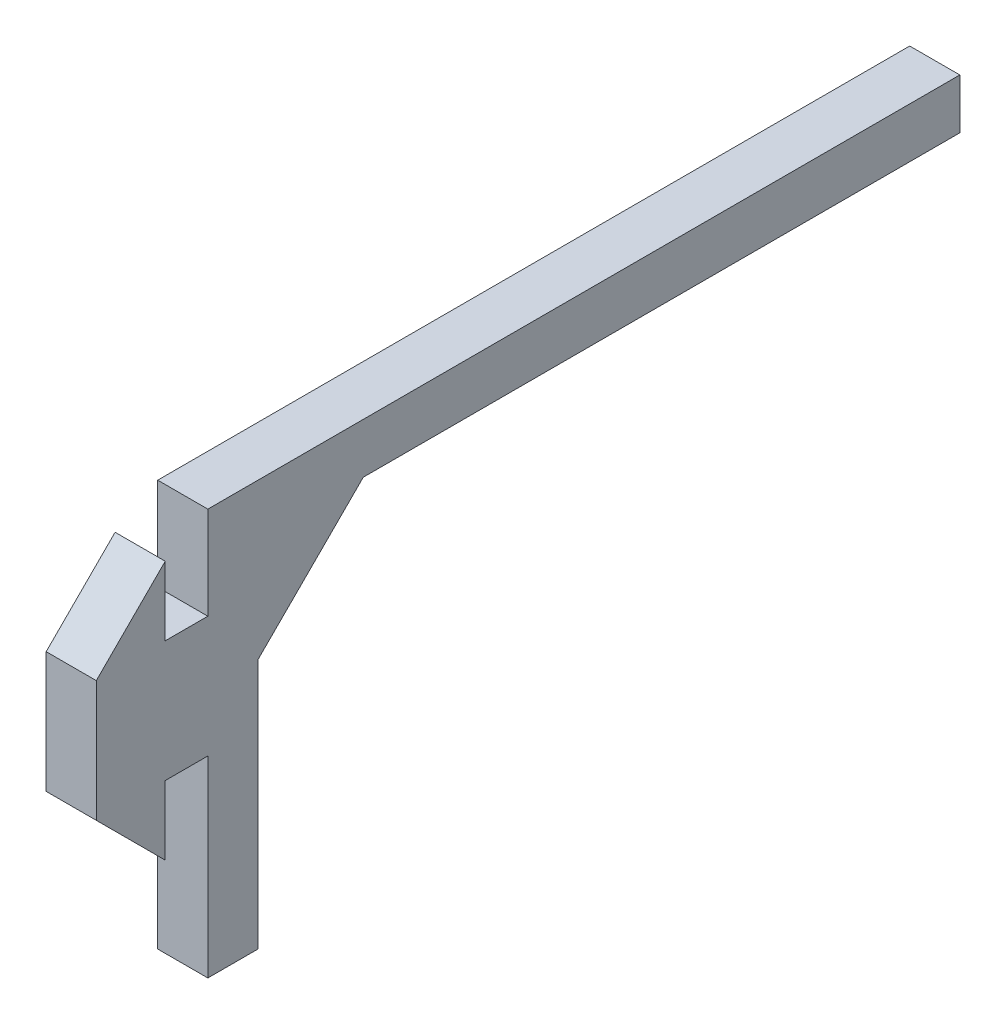
ISO-10303-21;
HEADER;
FILE_DESCRIPTION(('STEP AP214'),'2;1');
FILE_NAME('part.step','',(''),(''),'','','');
FILE_SCHEMA(('AUTOMOTIVE_DESIGN { 1 0 10303 214 1 1 1 1 }'));
ENDSEC;
DATA;
#1=APPLICATION_CONTEXT('core data for automotive mechanical design processes');
#2=APPLICATION_PROTOCOL_DEFINITION('international standard','automotive_design',2000,#1);
#3=PRODUCT_CONTEXT('',#1,'mechanical');
#4=PRODUCT('Part','Part','',(#3));
#5=PRODUCT_RELATED_PRODUCT_CATEGORY('part','',(#4));
#6=PRODUCT_DEFINITION_FORMATION('','',#4);
#7=PRODUCT_DEFINITION_CONTEXT('part definition',#1,'design');
#8=PRODUCT_DEFINITION('design','',#6,#7);
#9=PRODUCT_DEFINITION_SHAPE('','',#8);
#10=(LENGTH_UNIT() NAMED_UNIT(*) SI_UNIT(.MILLI.,.METRE.));
#11=(NAMED_UNIT(*) PLANE_ANGLE_UNIT() SI_UNIT($,.RADIAN.));
#12=(NAMED_UNIT(*) SI_UNIT($,.STERADIAN.) SOLID_ANGLE_UNIT());
#13=UNCERTAINTY_MEASURE_WITH_UNIT(LENGTH_MEASURE(1.E-05),#10,'distance_accuracy_value','');
#14=(GEOMETRIC_REPRESENTATION_CONTEXT(3) GLOBAL_UNCERTAINTY_ASSIGNED_CONTEXT((#13)) GLOBAL_UNIT_ASSIGNED_CONTEXT((#10,
#11,#12)) REPRESENTATION_CONTEXT('',''));
#15=CARTESIAN_POINT('',(0.,0.,0.));
#16=DIRECTION('',(0.,0.,1.));
#17=DIRECTION('',(1.,0.,0.));
#18=AXIS2_PLACEMENT_3D('',#15,#16,#17);
#19=CARTESIAN_POINT('',(2.,14.2,0.));
#20=DIRECTION('',(0.,-1.,0.));
#21=DIRECTION('',(0.,0.,-1.));
#22=AXIS2_PLACEMENT_3D('',#19,#20,#21);
#23=PLANE('',#22);
#24=DIRECTION('',(0.,0.,1.));
#25=VECTOR('',#24,1.);
#26=CARTESIAN_POINT('',(0.,14.2,0.));
#27=LINE('',#26,#25);
#28=CARTESIAN_POINT('',(0.,14.2,-30.));
#29=VERTEX_POINT('',#28);
#30=CARTESIAN_POINT('',(0.,14.2,-6.19999999999999));
#31=VERTEX_POINT('',#30);
#32=EDGE_CURVE('E172',#29,#31,#27,.T.);
#33=ORIENTED_EDGE('',*,*,#32,.F.);
#34=DIRECTION('',(-1.,0.,0.));
#35=VECTOR('',#34,1.);
#36=CARTESIAN_POINT('',(2.,14.2,-30.));
#37=LINE('',#36,#35);
#38=CARTESIAN_POINT('',(2.,14.2,-30.));
#39=VERTEX_POINT('',#38);
#40=EDGE_CURVE('E11',#39,#29,#37,.T.);
#41=ORIENTED_EDGE('',*,*,#40,.F.);
#42=DIRECTION('',(0.,0.,1.));
#43=VECTOR('',#42,1.);
#44=CARTESIAN_POINT('',(2.,14.2,0.));
#45=LINE('',#44,#43);
#46=CARTESIAN_POINT('',(2.,14.2,-6.19999999999999));
#47=VERTEX_POINT('',#46);
#48=EDGE_CURVE('E208',#39,#47,#45,.T.);
#49=ORIENTED_EDGE('',*,*,#48,.T.);
#50=DIRECTION('',(-1.,0.,0.));
#51=VECTOR('',#50,1.);
#52=CARTESIAN_POINT('',(2.,14.2,-6.19999999999999));
#53=LINE('',#52,#51);
#54=EDGE_CURVE('E106',#47,#31,#53,.T.);
#55=ORIENTED_EDGE('',*,*,#54,.T.);
#56=EDGE_LOOP('',(#33,#41,#49,#55));
#57=FACE_BOUND('',#56,.T.);
#58=ADVANCED_FACE('F35',(#57),#23,.T.);
#59=CARTESIAN_POINT('',(2.,0.,-30.));
#60=DIRECTION('',(0.,0.,-1.));
#61=DIRECTION('',(-1.,0.,0.));
#62=AXIS2_PLACEMENT_3D('',#59,#60,#61);
#63=PLANE('',#62);
#64=DIRECTION('',(0.,-1.,0.));
#65=VECTOR('',#64,1.);
#66=CARTESIAN_POINT('',(0.,0.,-30.));
#67=LINE('',#66,#65);
#68=CARTESIAN_POINT('',(0.,16.2,-30.));
#69=VERTEX_POINT('',#68);
#70=EDGE_CURVE('E175',#69,#29,#67,.T.);
#71=ORIENTED_EDGE('',*,*,#70,.F.);
#72=DIRECTION('',(-1.,0.,0.));
#73=VECTOR('',#72,1.);
#74=CARTESIAN_POINT('',(2.,16.2,-30.));
#75=LINE('',#74,#73);
#76=CARTESIAN_POINT('',(2.,16.2,-30.));
#77=VERTEX_POINT('',#76);
#78=EDGE_CURVE('E43',#77,#69,#75,.T.);
#79=ORIENTED_EDGE('',*,*,#78,.F.);
#80=DIRECTION('',(0.,-1.,0.));
#81=VECTOR('',#80,1.);
#82=CARTESIAN_POINT('',(2.,0.,-30.));
#83=LINE('',#82,#81);
#84=EDGE_CURVE('E253',#77,#39,#83,.T.);
#85=ORIENTED_EDGE('',*,*,#84,.T.);
#86=ORIENTED_EDGE('',*,*,#40,.T.);
#87=EDGE_LOOP('',(#71,#79,#85,#86));
#88=FACE_BOUND('',#87,.T.);
#89=ADVANCED_FACE('F241',(#88),#63,.T.);
#90=CARTESIAN_POINT('',(2.,16.2,0.));
#91=DIRECTION('',(0.,1.,0.));
#92=DIRECTION('',(0.,0.,1.));
#93=AXIS2_PLACEMENT_3D('',#90,#91,#92);
#94=PLANE('',#93);
#95=DIRECTION('',(0.,0.,-1.));
#96=VECTOR('',#95,1.);
#97=CARTESIAN_POINT('',(0.,16.2,0.));
#98=LINE('',#97,#96);
#99=CARTESIAN_POINT('',(0.,16.2,0.));
#100=VERTEX_POINT('',#99);
#101=EDGE_CURVE('E178',#100,#69,#98,.T.);
#102=ORIENTED_EDGE('',*,*,#101,.F.);
#103=DIRECTION('',(-1.,0.,0.));
#104=VECTOR('',#103,1.);
#105=CARTESIAN_POINT('',(2.,16.2,0.));
#106=LINE('',#105,#104);
#107=CARTESIAN_POINT('',(2.,16.2,0.));
#108=VERTEX_POINT('',#107);
#109=EDGE_CURVE('E230',#108,#100,#106,.T.);
#110=ORIENTED_EDGE('',*,*,#109,.F.);
#111=DIRECTION('',(0.,0.,-1.));
#112=VECTOR('',#111,1.);
#113=CARTESIAN_POINT('',(2.,16.2,0.));
#114=LINE('',#113,#112);
#115=EDGE_CURVE('E237',#108,#77,#114,.T.);
#116=ORIENTED_EDGE('',*,*,#115,.T.);
#117=ORIENTED_EDGE('',*,*,#78,.T.);
#118=EDGE_LOOP('',(#102,#110,#116,#117));
#119=FACE_BOUND('',#118,.T.);
#120=ADVANCED_FACE('F235',(#119),#94,.T.);
#121=CARTESIAN_POINT('',(2.,0.,0.));
#122=DIRECTION('',(0.,0.,1.));
#123=DIRECTION('',(1.,0.,0.));
#124=AXIS2_PLACEMENT_3D('',#121,#122,#123);
#125=PLANE('',#124);
#126=DIRECTION('',(0.,1.,0.));
#127=VECTOR('',#126,1.);
#128=CARTESIAN_POINT('',(0.,0.,0.));
#129=LINE('',#128,#127);
#130=CARTESIAN_POINT('',(0.,12.5,0.));
#131=VERTEX_POINT('',#130);
#132=EDGE_CURVE('E181',#131,#100,#129,.T.);
#133=ORIENTED_EDGE('',*,*,#132,.F.);
#134=DIRECTION('',(-1.,0.,0.));
#135=VECTOR('',#134,1.);
#136=CARTESIAN_POINT('',(2.,12.5,0.));
#137=LINE('',#136,#135);
#138=CARTESIAN_POINT('',(2.,12.5,0.));
#139=VERTEX_POINT('',#138);
#140=EDGE_CURVE('E228',#139,#131,#137,.T.);
#141=ORIENTED_EDGE('',*,*,#140,.F.);
#142=DIRECTION('',(0.,1.,0.));
#143=VECTOR('',#142,1.);
#144=CARTESIAN_POINT('',(2.,0.,0.));
#145=LINE('',#144,#143);
#146=EDGE_CURVE('E167',#139,#108,#145,.T.);
#147=ORIENTED_EDGE('',*,*,#146,.T.);
#148=ORIENTED_EDGE('',*,*,#109,.T.);
#149=EDGE_LOOP('',(#133,#141,#147,#148));
#150=FACE_BOUND('',#149,.T.);
#151=ADVANCED_FACE('F248',(#150),#125,.T.);
#152=CARTESIAN_POINT('',(2.,12.5,0.));
#153=DIRECTION('',(0.,1.,0.));
#154=DIRECTION('',(0.,0.,1.));
#155=AXIS2_PLACEMENT_3D('',#152,#153,#154);
#156=PLANE('',#155);
#157=DIRECTION('',(0.,0.,-1.));
#158=VECTOR('',#157,1.);
#159=CARTESIAN_POINT('',(0.,12.5,0.));
#160=LINE('',#159,#158);
#161=CARTESIAN_POINT('',(0.,12.5,1.7));
#162=VERTEX_POINT('',#161);
#163=EDGE_CURVE('E184',#162,#131,#160,.T.);
#164=ORIENTED_EDGE('',*,*,#163,.F.);
#165=DIRECTION('',(-1.,0.,0.));
#166=VECTOR('',#165,1.);
#167=CARTESIAN_POINT('',(2.,12.5,1.7));
#168=LINE('',#167,#166);
#169=CARTESIAN_POINT('',(2.,12.5,1.7));
#170=VERTEX_POINT('',#169);
#171=EDGE_CURVE('E226',#170,#162,#168,.T.);
#172=ORIENTED_EDGE('',*,*,#171,.F.);
#173=DIRECTION('',(0.,0.,-1.));
#174=VECTOR('',#173,1.);
#175=CARTESIAN_POINT('',(2.,12.5,0.));
#176=LINE('',#175,#174);
#177=EDGE_CURVE('E255',#170,#139,#176,.T.);
#178=ORIENTED_EDGE('',*,*,#177,.T.);
#179=ORIENTED_EDGE('',*,*,#140,.T.);
#180=EDGE_LOOP('',(#164,#172,#178,#179));
#181=FACE_BOUND('',#180,.T.);
#182=ADVANCED_FACE('F294',(#181),#156,.T.);
#183=CARTESIAN_POINT('',(2.,0.,1.7));
#184=DIRECTION('',(0.,0.,1.));
#185=DIRECTION('',(1.,0.,0.));
#186=AXIS2_PLACEMENT_3D('',#183,#184,#185);
#187=PLANE('',#186);
#188=DIRECTION('',(0.,1.,0.));
#189=VECTOR('',#188,1.);
#190=CARTESIAN_POINT('',(0.,0.,1.7));
#191=LINE('',#190,#189);
#192=CARTESIAN_POINT('',(0.,15.25,1.7));
#193=VERTEX_POINT('',#192);
#194=EDGE_CURVE('E188',#162,#193,#191,.T.);
#195=ORIENTED_EDGE('',*,*,#194,.T.);
#196=DIRECTION('',(-1.,0.,0.));
#197=VECTOR('',#196,1.);
#198=CARTESIAN_POINT('',(2.,15.25,1.7));
#199=LINE('',#198,#197);
#200=CARTESIAN_POINT('',(2.,15.25,1.7));
#201=VERTEX_POINT('',#200);
#202=EDGE_CURVE('E223',#201,#193,#199,.T.);
#203=ORIENTED_EDGE('',*,*,#202,.F.);
#204=DIRECTION('',(0.,1.,0.));
#205=VECTOR('',#204,1.);
#206=CARTESIAN_POINT('',(2.,0.,1.7));
#207=LINE('',#206,#205);
#208=EDGE_CURVE('E260',#170,#201,#207,.T.);
#209=ORIENTED_EDGE('',*,*,#208,.F.);
#210=ORIENTED_EDGE('',*,*,#171,.T.);
#211=EDGE_LOOP('',(#195,#203,#209,#210));
#212=FACE_BOUND('',#211,.T.);
#213=ADVANCED_FACE('F297',(#212),#187,.F.);
#214=CARTESIAN_POINT('',(2.,8.47499999999992,8.47500000000001));
#215=DIRECTION('',(0.,-0.707106781186544,-0.707106781186551));
#216=DIRECTION('',(0.,0.707106781186551,-0.707106781186544));
#217=AXIS2_PLACEMENT_3D('',#214,#215,#216);
#218=PLANE('',#217);
#219=DIRECTION('',(0.,-0.707106781186551,0.707106781186544));
#220=VECTOR('',#219,1.);
#221=CARTESIAN_POINT('',(0.,8.47499999999992,8.47500000000001));
#222=LINE('',#221,#220);
#223=CARTESIAN_POINT('',(0.,12.5,4.44999999999997));
#224=VERTEX_POINT('',#223);
#225=EDGE_CURVE('E190',#193,#224,#222,.T.);
#226=ORIENTED_EDGE('',*,*,#225,.T.);
#227=DIRECTION('',(-1.,0.,0.));
#228=VECTOR('',#227,1.);
#229=CARTESIAN_POINT('',(2.,12.5,4.44999999999997));
#230=LINE('',#229,#228);
#231=CARTESIAN_POINT('',(2.,12.5,4.44999999999997));
#232=VERTEX_POINT('',#231);
#233=EDGE_CURVE('E220',#232,#224,#230,.T.);
#234=ORIENTED_EDGE('',*,*,#233,.F.);
#235=DIRECTION('',(0.,-0.707106781186551,0.707106781186544));
#236=VECTOR('',#235,1.);
#237=CARTESIAN_POINT('',(2.,8.47499999999992,8.47500000000001));
#238=LINE('',#237,#236);
#239=EDGE_CURVE('E262',#201,#232,#238,.T.);
#240=ORIENTED_EDGE('',*,*,#239,.F.);
#241=ORIENTED_EDGE('',*,*,#202,.T.);
#242=EDGE_LOOP('',(#226,#234,#240,#241));
#243=FACE_BOUND('',#242,.T.);
#244=ADVANCED_FACE('F301',(#243),#218,.F.);
#245=CARTESIAN_POINT('',(2.,0.,4.44999999999997));
#246=DIRECTION('',(0.,0.,-1.));
#247=DIRECTION('',(-1.,0.,0.));
#248=AXIS2_PLACEMENT_3D('',#245,#246,#247);
#249=PLANE('',#248);
#250=DIRECTION('',(0.,-1.,0.));
#251=VECTOR('',#250,1.);
#252=CARTESIAN_POINT('',(0.,0.,4.44999999999997));
#253=LINE('',#252,#251);
#254=CARTESIAN_POINT('',(0.,7.67168062195139,4.44999999999997));
#255=VERTEX_POINT('',#254);
#256=EDGE_CURVE('E192',#224,#255,#253,.T.);
#257=ORIENTED_EDGE('',*,*,#256,.T.);
#258=DIRECTION('',(-1.,0.,0.));
#259=VECTOR('',#258,1.);
#260=CARTESIAN_POINT('',(2.,7.67168062195139,4.44999999999997));
#261=LINE('',#260,#259);
#262=CARTESIAN_POINT('',(2.,7.67168062195139,4.44999999999997));
#263=VERTEX_POINT('',#262);
#264=EDGE_CURVE('E218',#263,#255,#261,.T.);
#265=ORIENTED_EDGE('',*,*,#264,.F.);
#266=DIRECTION('',(0.,-1.,0.));
#267=VECTOR('',#266,1.);
#268=CARTESIAN_POINT('',(2.,0.,4.44999999999997));
#269=LINE('',#268,#267);
#270=EDGE_CURVE('E264',#232,#263,#269,.T.);
#271=ORIENTED_EDGE('',*,*,#270,.F.);
#272=ORIENTED_EDGE('',*,*,#233,.T.);
#273=EDGE_LOOP('',(#257,#265,#271,#272));
#274=FACE_BOUND('',#273,.T.);
#275=ADVANCED_FACE('F305',(#274),#249,.F.);
#276=CARTESIAN_POINT('',(2.,1.61084031097575,-1.61084031097573));
#277=DIRECTION('',(0.,-0.707106781186551,0.707106781186544));
#278=DIRECTION('',(0.,-0.707106781186544,-0.707106781186551));
#279=AXIS2_PLACEMENT_3D('',#276,#277,#278);
#280=PLANE('',#279);
#281=DIRECTION('',(0.,0.707106781186544,0.707106781186551));
#282=VECTOR('',#281,1.);
#283=CARTESIAN_POINT('',(0.,1.61084031097575,-1.61084031097573));
#284=LINE('',#283,#282);
#285=CARTESIAN_POINT('',(0.,4.92168062195145,1.7));
#286=VERTEX_POINT('',#285);
#287=EDGE_CURVE('E195',#286,#255,#284,.T.);
#288=ORIENTED_EDGE('',*,*,#287,.F.);
#289=DIRECTION('',(-1.,0.,0.));
#290=VECTOR('',#289,1.);
#291=CARTESIAN_POINT('',(2.,4.92168062195145,1.7));
#292=LINE('',#291,#290);
#293=CARTESIAN_POINT('',(2.,4.92168062195145,1.7));
#294=VERTEX_POINT('',#293);
#295=EDGE_CURVE('E216',#294,#286,#292,.T.);
#296=ORIENTED_EDGE('',*,*,#295,.F.);
#297=DIRECTION('',(0.,0.707106781186544,0.707106781186551));
#298=VECTOR('',#297,1.);
#299=CARTESIAN_POINT('',(2.,1.61084031097575,-1.61084031097573));
#300=LINE('',#299,#298);
#301=EDGE_CURVE('E266',#294,#263,#300,.T.);
#302=ORIENTED_EDGE('',*,*,#301,.T.);
#303=ORIENTED_EDGE('',*,*,#264,.T.);
#304=EDGE_LOOP('',(#288,#296,#302,#303));
#305=FACE_BOUND('',#304,.T.);
#306=ADVANCED_FACE('F309',(#305),#280,.T.);
#307=CARTESIAN_POINT('',(2.,0.,1.7));
#308=DIRECTION('',(0.,0.,-1.));
#309=DIRECTION('',(0.,1.,0.));
#310=AXIS2_PLACEMENT_3D('',#307,#308,#309);
#311=PLANE('',#310);
#312=DIRECTION('',(0.,-1.,0.));
#313=VECTOR('',#312,1.);
#314=CARTESIAN_POINT('',(0.,0.,1.7));
#315=LINE('',#314,#313);
#316=CARTESIAN_POINT('',(0.,7.67168062195145,1.7));
#317=VERTEX_POINT('',#316);
#318=EDGE_CURVE('E198',#317,#286,#315,.T.);
#319=ORIENTED_EDGE('',*,*,#318,.F.);
#320=DIRECTION('',(-1.,0.,0.));
#321=VECTOR('',#320,1.);
#322=CARTESIAN_POINT('',(2.,7.67168062195145,1.7));
#323=LINE('',#322,#321);
#324=CARTESIAN_POINT('',(2.,7.67168062195145,1.7));
#325=VERTEX_POINT('',#324);
#326=EDGE_CURVE('E214',#325,#317,#323,.T.);
#327=ORIENTED_EDGE('',*,*,#326,.F.);
#328=DIRECTION('',(0.,-1.,0.));
#329=VECTOR('',#328,1.);
#330=CARTESIAN_POINT('',(2.,0.,1.7));
#331=LINE('',#330,#329);
#332=EDGE_CURVE('E268',#325,#294,#331,.T.);
#333=ORIENTED_EDGE('',*,*,#332,.T.);
#334=ORIENTED_EDGE('',*,*,#295,.T.);
#335=EDGE_LOOP('',(#319,#327,#333,#334));
#336=FACE_BOUND('',#335,.T.);
#337=ADVANCED_FACE('F313',(#336),#311,.T.);
#338=CARTESIAN_POINT('',(2.,7.67168062195145,0.));
#339=DIRECTION('',(0.,1.,0.));
#340=DIRECTION('',(0.,0.,1.));
#341=AXIS2_PLACEMENT_3D('',#338,#339,#340);
#342=PLANE('',#341);
#343=DIRECTION('',(0.,0.,-1.));
#344=VECTOR('',#343,1.);
#345=CARTESIAN_POINT('',(0.,7.67168062195145,0.));
#346=LINE('',#345,#344);
#347=CARTESIAN_POINT('',(0.,7.67168062195145,0.));
#348=VERTEX_POINT('',#347);
#349=EDGE_CURVE('E201',#317,#348,#346,.T.);
#350=ORIENTED_EDGE('',*,*,#349,.T.);
#351=DIRECTION('',(-1.,0.,0.));
#352=VECTOR('',#351,1.);
#353=CARTESIAN_POINT('',(2.,7.67168062195145,0.));
#354=LINE('',#353,#352);
#355=CARTESIAN_POINT('',(2.,7.67168062195145,0.));
#356=VERTEX_POINT('',#355);
#357=EDGE_CURVE('E212',#356,#348,#354,.T.);
#358=ORIENTED_EDGE('',*,*,#357,.F.);
#359=DIRECTION('',(0.,0.,-1.));
#360=VECTOR('',#359,1.);
#361=CARTESIAN_POINT('',(2.,7.67168062195145,0.));
#362=LINE('',#361,#360);
#363=EDGE_CURVE('E165',#325,#356,#362,.T.);
#364=ORIENTED_EDGE('',*,*,#363,.F.);
#365=ORIENTED_EDGE('',*,*,#326,.T.);
#366=EDGE_LOOP('',(#350,#358,#364,#365));
#367=FACE_BOUND('',#366,.T.);
#368=ADVANCED_FACE('F276',(#367),#342,.F.);
#369=CARTESIAN_POINT('',(0.,0.,0.));
#370=VERTEX_POINT('',#369);
#371=EDGE_CURVE('E185',#370,#348,#129,.T.);
#372=ORIENTED_EDGE('',*,*,#371,.F.);
#373=DIRECTION('',(-1.,0.,0.));
#374=VECTOR('',#373,1.);
#375=CARTESIAN_POINT('',(2.,0.,0.));
#376=LINE('',#375,#374);
#377=CARTESIAN_POINT('',(2.,0.,0.));
#378=VERTEX_POINT('',#377);
#379=EDGE_CURVE('E154',#378,#370,#376,.T.);
#380=ORIENTED_EDGE('',*,*,#379,.F.);
#381=EDGE_CURVE('E163',#378,#356,#145,.T.);
#382=ORIENTED_EDGE('',*,*,#381,.T.);
#383=ORIENTED_EDGE('',*,*,#357,.T.);
#384=EDGE_LOOP('',(#372,#380,#382,#383));
#385=FACE_BOUND('',#384,.T.);
#386=ADVANCED_FACE('F281',(#385),#125,.T.);
#387=CARTESIAN_POINT('',(2.,0.,0.));
#388=DIRECTION('',(0.,-1.,0.));
#389=DIRECTION('',(0.,0.,-1.));
#390=AXIS2_PLACEMENT_3D('',#387,#388,#389);
#391=PLANE('',#390);
#392=DIRECTION('',(0.,0.,1.));
#393=VECTOR('',#392,1.);
#394=CARTESIAN_POINT('',(0.,0.,0.));
#395=LINE('',#394,#393);
#396=CARTESIAN_POINT('',(0.,0.,-2.));
#397=VERTEX_POINT('',#396);
#398=EDGE_CURVE('E153',#397,#370,#395,.T.);
#399=ORIENTED_EDGE('',*,*,#398,.F.);
#400=DIRECTION('',(-1.,0.,0.));
#401=VECTOR('',#400,1.);
#402=CARTESIAN_POINT('',(2.,0.,-2.));
#403=LINE('',#402,#401);
#404=CARTESIAN_POINT('',(2.,0.,-2.));
#405=VERTEX_POINT('',#404);
#406=EDGE_CURVE('E147',#405,#397,#403,.T.);
#407=ORIENTED_EDGE('',*,*,#406,.F.);
#408=DIRECTION('',(0.,0.,1.));
#409=VECTOR('',#408,1.);
#410=CARTESIAN_POINT('',(2.,0.,0.));
#411=LINE('',#410,#409);
#412=EDGE_CURVE('E151',#405,#378,#411,.T.);
#413=ORIENTED_EDGE('',*,*,#412,.T.);
#414=ORIENTED_EDGE('',*,*,#379,.T.);
#415=EDGE_LOOP('',(#399,#407,#413,#414));
#416=FACE_BOUND('',#415,.T.);
#417=ADVANCED_FACE('F149',(#416),#391,.T.);
#418=CARTESIAN_POINT('',(2.,0.,-2.));
#419=DIRECTION('',(0.,0.,1.));
#420=DIRECTION('',(1.,0.,0.));
#421=AXIS2_PLACEMENT_3D('',#418,#419,#420);
#422=PLANE('',#421);
#423=DIRECTION('',(0.,1.,0.));
#424=VECTOR('',#423,1.);
#425=CARTESIAN_POINT('',(0.,0.,-2.));
#426=LINE('',#425,#424);
#427=CARTESIAN_POINT('',(0.,10.,-2.));
#428=VERTEX_POINT('',#427);
#429=EDGE_CURVE('E99',#397,#428,#426,.T.);
#430=ORIENTED_EDGE('',*,*,#429,.T.);
#431=DIRECTION('',(-1.,0.,0.));
#432=VECTOR('',#431,1.);
#433=CARTESIAN_POINT('',(2.,10.,-2.));
#434=LINE('',#433,#432);
#435=CARTESIAN_POINT('',(2.,10.,-2.));
#436=VERTEX_POINT('',#435);
#437=EDGE_CURVE('E155',#436,#428,#434,.T.);
#438=ORIENTED_EDGE('',*,*,#437,.F.);
#439=DIRECTION('',(0.,1.,0.));
#440=VECTOR('',#439,1.);
#441=CARTESIAN_POINT('',(2.,0.,-2.));
#442=LINE('',#441,#440);
#443=EDGE_CURVE('E157',#405,#436,#442,.T.);
#444=ORIENTED_EDGE('',*,*,#443,.F.);
#445=ORIENTED_EDGE('',*,*,#406,.T.);
#446=EDGE_LOOP('',(#430,#438,#444,#445));
#447=FACE_BOUND('',#446,.T.);
#448=ADVANCED_FACE('F158',(#447),#422,.F.);
#449=CARTESIAN_POINT('',(2.,3.99999999999998,4.));
#450=DIRECTION('',(0.,0.707106781186546,0.707106781186549));
#451=DIRECTION('',(0.,-0.707106781186549,0.707106781186546));
#452=AXIS2_PLACEMENT_3D('',#449,#450,#451);
#453=PLANE('',#452);
#454=DIRECTION('',(0.,0.707106781186549,-0.707106781186546));
#455=VECTOR('',#454,1.);
#456=CARTESIAN_POINT('',(0.,3.99999999999998,4.));
#457=LINE('',#456,#455);
#458=EDGE_CURVE('E206',#428,#31,#457,.T.);
#459=ORIENTED_EDGE('',*,*,#458,.T.);
#460=ORIENTED_EDGE('',*,*,#54,.F.);
#461=DIRECTION('',(0.,0.707106781186549,-0.707106781186546));
#462=VECTOR('',#461,1.);
#463=CARTESIAN_POINT('',(2.,3.99999999999998,4.));
#464=LINE('',#463,#462);
#465=EDGE_CURVE('E51',#436,#47,#464,.T.);
#466=ORIENTED_EDGE('',*,*,#465,.F.);
#467=ORIENTED_EDGE('',*,*,#437,.T.);
#468=EDGE_LOOP('',(#459,#460,#466,#467));
#469=FACE_BOUND('',#468,.T.);
#470=ADVANCED_FACE('F284',(#469),#453,.F.);
#471=CARTESIAN_POINT('',(2.,0.,0.));
#472=DIRECTION('',(1.,0.,0.));
#473=DIRECTION('',(0.,0.,-1.));
#474=AXIS2_PLACEMENT_3D('',#471,#472,#473);
#475=PLANE('',#474);
#476=ORIENTED_EDGE('',*,*,#48,.F.);
#477=ORIENTED_EDGE('',*,*,#84,.F.);
#478=ORIENTED_EDGE('',*,*,#115,.F.);
#479=ORIENTED_EDGE('',*,*,#146,.F.);
#480=ORIENTED_EDGE('',*,*,#177,.F.);
#481=ORIENTED_EDGE('',*,*,#208,.T.);
#482=ORIENTED_EDGE('',*,*,#239,.T.);
#483=ORIENTED_EDGE('',*,*,#270,.T.);
#484=ORIENTED_EDGE('',*,*,#301,.F.);
#485=ORIENTED_EDGE('',*,*,#332,.F.);
#486=ORIENTED_EDGE('',*,*,#363,.T.);
#487=ORIENTED_EDGE('',*,*,#381,.F.);
#488=ORIENTED_EDGE('',*,*,#412,.F.);
#489=ORIENTED_EDGE('',*,*,#443,.T.);
#490=ORIENTED_EDGE('',*,*,#465,.T.);
#491=EDGE_LOOP('',(#476,#477,#478,#479,#480,#481,#482,#483,#484,#485,#486,#487,#488,#489,#490));
#492=FACE_BOUND('',#491,.T.);
#493=ADVANCED_FACE('F161',(#492),#475,.T.);
#494=CARTESIAN_POINT('',(0.,0.,0.));
#495=DIRECTION('',(1.,0.,0.));
#496=DIRECTION('',(0.,0.,-1.));
#497=AXIS2_PLACEMENT_3D('',#494,#495,#496);
#498=PLANE('',#497);
#499=ORIENTED_EDGE('',*,*,#32,.T.);
#500=ORIENTED_EDGE('',*,*,#458,.F.);
#501=ORIENTED_EDGE('',*,*,#429,.F.);
#502=ORIENTED_EDGE('',*,*,#398,.T.);
#503=ORIENTED_EDGE('',*,*,#371,.T.);
#504=ORIENTED_EDGE('',*,*,#349,.F.);
#505=ORIENTED_EDGE('',*,*,#318,.T.);
#506=ORIENTED_EDGE('',*,*,#287,.T.);
#507=ORIENTED_EDGE('',*,*,#256,.F.);
#508=ORIENTED_EDGE('',*,*,#225,.F.);
#509=ORIENTED_EDGE('',*,*,#194,.F.);
#510=ORIENTED_EDGE('',*,*,#163,.T.);
#511=ORIENTED_EDGE('',*,*,#132,.T.);
#512=ORIENTED_EDGE('',*,*,#101,.T.);
#513=ORIENTED_EDGE('',*,*,#70,.T.);
#514=EDGE_LOOP('',(#499,#500,#501,#502,#503,#504,#505,#506,#507,#508,#509,#510,#511,#512,#513));
#515=FACE_BOUND('',#514,.T.);
#516=ADVANCED_FACE('F243',(#515),#498,.F.);
#517=CLOSED_SHELL('',(#58,#89,#120,#151,#182,#213,#244,#275,#306,#337,#368,#386,#417,#448,#470,
#493,#516));
#518=MANIFOLD_SOLID_BREP('B2',#517);
#519=ADVANCED_BREP_SHAPE_REPRESENTATION('',(#18,#518),#14);
#520=SHAPE_DEFINITION_REPRESENTATION(#9,#519);
ENDSEC;
END-ISO-10303-21;
